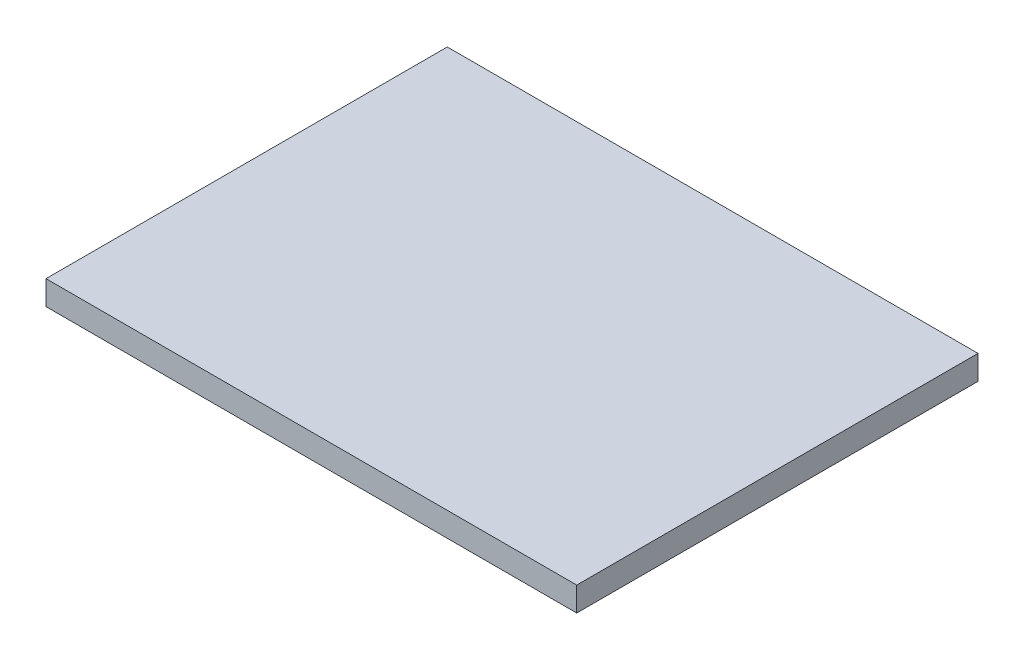
ISO-10303-21;
HEADER;
FILE_DESCRIPTION(('STEP AP214'),'2;1');
FILE_NAME('part.step','',(''),(''),'','','');
FILE_SCHEMA(('AUTOMOTIVE_DESIGN { 1 0 10303 214 1 1 1 1 }'));
ENDSEC;
DATA;
#1=APPLICATION_CONTEXT('core data for automotive mechanical design processes');
#2=APPLICATION_PROTOCOL_DEFINITION('international standard','automotive_design',2000,#1);
#3=PRODUCT_CONTEXT('',#1,'mechanical');
#4=PRODUCT('Part','Part','',(#3));
#5=PRODUCT_RELATED_PRODUCT_CATEGORY('part','',(#4));
#6=PRODUCT_DEFINITION_FORMATION('','',#4);
#7=PRODUCT_DEFINITION_CONTEXT('part definition',#1,'design');
#8=PRODUCT_DEFINITION('design','',#6,#7);
#9=PRODUCT_DEFINITION_SHAPE('','',#8);
#10=(LENGTH_UNIT() NAMED_UNIT(*) SI_UNIT(.MILLI.,.METRE.));
#11=(NAMED_UNIT(*) PLANE_ANGLE_UNIT() SI_UNIT($,.RADIAN.));
#12=(NAMED_UNIT(*) SI_UNIT($,.STERADIAN.) SOLID_ANGLE_UNIT());
#13=UNCERTAINTY_MEASURE_WITH_UNIT(LENGTH_MEASURE(1.E-05),#10,'distance_accuracy_value','');
#14=(GEOMETRIC_REPRESENTATION_CONTEXT(3) GLOBAL_UNCERTAINTY_ASSIGNED_CONTEXT((#13)) GLOBAL_UNIT_ASSIGNED_CONTEXT((#10,
#11,#12)) REPRESENTATION_CONTEXT('',''));
#15=CARTESIAN_POINT('',(0.,0.,0.));
#16=DIRECTION('',(0.,0.,1.));
#17=DIRECTION('',(1.,0.,0.));
#18=AXIS2_PLACEMENT_3D('',#15,#16,#17);
#19=CARTESIAN_POINT('',(0.,11.8872,0.));
#20=DIRECTION('',(1.,0.,0.));
#21=DIRECTION('',(0.,0.,-1.));
#22=AXIS2_PLACEMENT_3D('',#19,#20,#21);
#23=PLANE('',#22);
#24=DIRECTION('',(0.,0.,1.));
#25=VECTOR('',#24,1.);
#26=CARTESIAN_POINT('',(0.,0.,0.));
#27=LINE('',#26,#25);
#28=CARTESIAN_POINT('',(0.,0.,-196.85));
#29=VERTEX_POINT('',#28);
#30=CARTESIAN_POINT('',(0.,0.,0.));
#31=VERTEX_POINT('',#30);
#32=EDGE_CURVE('E96',#29,#31,#27,.T.);
#33=ORIENTED_EDGE('',*,*,#32,.T.);
#34=DIRECTION('',(0.,-1.,0.));
#35=VECTOR('',#34,1.);
#36=CARTESIAN_POINT('',(0.,11.8872,0.));
#37=LINE('',#36,#35);
#38=CARTESIAN_POINT('',(0.,11.8872,0.));
#39=VERTEX_POINT('',#38);
#40=EDGE_CURVE('E11',#39,#31,#37,.T.);
#41=ORIENTED_EDGE('',*,*,#40,.F.);
#42=DIRECTION('',(0.,0.,1.));
#43=VECTOR('',#42,1.);
#44=CARTESIAN_POINT('',(0.,11.8872,0.));
#45=LINE('',#44,#43);
#46=CARTESIAN_POINT('',(0.,11.8872,-196.85));
#47=VERTEX_POINT('',#46);
#48=EDGE_CURVE('E84',#47,#39,#45,.T.);
#49=ORIENTED_EDGE('',*,*,#48,.F.);
#50=DIRECTION('',(0.,-1.,0.));
#51=VECTOR('',#50,1.);
#52=CARTESIAN_POINT('',(0.,11.8872,-196.85));
#53=LINE('',#52,#51);
#54=EDGE_CURVE('E92',#47,#29,#53,.T.);
#55=ORIENTED_EDGE('',*,*,#54,.T.);
#56=EDGE_LOOP('',(#33,#41,#49,#55));
#57=FACE_BOUND('',#56,.T.);
#58=ADVANCED_FACE('F33',(#57),#23,.F.);
#59=CARTESIAN_POINT('',(0.,11.8872,0.));
#60=DIRECTION('',(0.,0.,-1.));
#61=DIRECTION('',(-1.,0.,0.));
#62=AXIS2_PLACEMENT_3D('',#59,#60,#61);
#63=PLANE('',#62);
#64=DIRECTION('',(1.,0.,0.));
#65=VECTOR('',#64,1.);
#66=CARTESIAN_POINT('',(0.,0.,0.));
#67=LINE('',#66,#65);
#68=CARTESIAN_POINT('',(260.35,0.,0.));
#69=VERTEX_POINT('',#68);
#70=EDGE_CURVE('E88',#31,#69,#67,.T.);
#71=ORIENTED_EDGE('',*,*,#70,.T.);
#72=DIRECTION('',(0.,-1.,0.));
#73=VECTOR('',#72,1.);
#74=CARTESIAN_POINT('',(260.35,11.8872,0.));
#75=LINE('',#74,#73);
#76=CARTESIAN_POINT('',(260.35,11.8872,0.));
#77=VERTEX_POINT('',#76);
#78=EDGE_CURVE('E41',#77,#69,#75,.T.);
#79=ORIENTED_EDGE('',*,*,#78,.F.);
#80=DIRECTION('',(1.,0.,0.));
#81=VECTOR('',#80,1.);
#82=CARTESIAN_POINT('',(0.,11.8872,0.));
#83=LINE('',#82,#81);
#84=EDGE_CURVE('E79',#39,#77,#83,.T.);
#85=ORIENTED_EDGE('',*,*,#84,.F.);
#86=ORIENTED_EDGE('',*,*,#40,.T.);
#87=EDGE_LOOP('',(#71,#79,#85,#86));
#88=FACE_BOUND('',#87,.T.);
#89=ADVANCED_FACE('F87',(#88),#63,.F.);
#90=CARTESIAN_POINT('',(260.35,11.8872,0.));
#91=DIRECTION('',(-1.,0.,0.));
#92=DIRECTION('',(0.,0.,1.));
#93=AXIS2_PLACEMENT_3D('',#90,#91,#92);
#94=PLANE('',#93);
#95=DIRECTION('',(0.,0.,-1.));
#96=VECTOR('',#95,1.);
#97=CARTESIAN_POINT('',(260.35,0.,0.));
#98=LINE('',#97,#96);
#99=CARTESIAN_POINT('',(260.35,0.,-196.85));
#100=VERTEX_POINT('',#99);
#101=EDGE_CURVE('E66',#69,#100,#98,.T.);
#102=ORIENTED_EDGE('',*,*,#101,.T.);
#103=DIRECTION('',(0.,-1.,0.));
#104=VECTOR('',#103,1.);
#105=CARTESIAN_POINT('',(260.35,11.8872,-196.85));
#106=LINE('',#105,#104);
#107=CARTESIAN_POINT('',(260.35,11.8872,-196.85));
#108=VERTEX_POINT('',#107);
#109=EDGE_CURVE('E89',#108,#100,#106,.T.);
#110=ORIENTED_EDGE('',*,*,#109,.F.);
#111=DIRECTION('',(0.,0.,-1.));
#112=VECTOR('',#111,1.);
#113=CARTESIAN_POINT('',(260.35,11.8872,0.));
#114=LINE('',#113,#112);
#115=EDGE_CURVE('E82',#77,#108,#114,.T.);
#116=ORIENTED_EDGE('',*,*,#115,.F.);
#117=ORIENTED_EDGE('',*,*,#78,.T.);
#118=EDGE_LOOP('',(#102,#110,#116,#117));
#119=FACE_BOUND('',#118,.T.);
#120=ADVANCED_FACE('F90',(#119),#94,.F.);
#121=CARTESIAN_POINT('',(0.,11.8872,-196.85));
#122=DIRECTION('',(0.,0.,1.));
#123=DIRECTION('',(1.,0.,0.));
#124=AXIS2_PLACEMENT_3D('',#121,#122,#123);
#125=PLANE('',#124);
#126=DIRECTION('',(-1.,0.,0.));
#127=VECTOR('',#126,1.);
#128=CARTESIAN_POINT('',(0.,0.,-196.85));
#129=LINE('',#128,#127);
#130=EDGE_CURVE('E72',#100,#29,#129,.T.);
#131=ORIENTED_EDGE('',*,*,#130,.T.);
#132=ORIENTED_EDGE('',*,*,#54,.F.);
#133=DIRECTION('',(-1.,0.,0.));
#134=VECTOR('',#133,1.);
#135=CARTESIAN_POINT('',(0.,11.8872,-196.85));
#136=LINE('',#135,#134);
#137=EDGE_CURVE('E49',#108,#47,#136,.T.);
#138=ORIENTED_EDGE('',*,*,#137,.F.);
#139=ORIENTED_EDGE('',*,*,#109,.T.);
#140=EDGE_LOOP('',(#131,#132,#138,#139));
#141=FACE_BOUND('',#140,.T.);
#142=ADVANCED_FACE('F103',(#141),#125,.F.);
#143=CARTESIAN_POINT('',(0.,11.8872,0.));
#144=DIRECTION('',(0.,-1.,0.));
#145=DIRECTION('',(0.,0.,-1.));
#146=AXIS2_PLACEMENT_3D('',#143,#144,#145);
#147=PLANE('',#146);
#148=ORIENTED_EDGE('',*,*,#48,.T.);
#149=ORIENTED_EDGE('',*,*,#84,.T.);
#150=ORIENTED_EDGE('',*,*,#115,.T.);
#151=ORIENTED_EDGE('',*,*,#137,.T.);
#152=EDGE_LOOP('',(#148,#149,#150,#151));
#153=FACE_BOUND('',#152,.T.);
#154=ADVANCED_FACE('F80',(#153),#147,.F.);
#155=CARTESIAN_POINT('',(0.,0.,0.));
#156=DIRECTION('',(0.,-1.,0.));
#157=DIRECTION('',(0.,0.,-1.));
#158=AXIS2_PLACEMENT_3D('',#155,#156,#157);
#159=PLANE('',#158);
#160=ORIENTED_EDGE('',*,*,#32,.F.);
#161=ORIENTED_EDGE('',*,*,#130,.F.);
#162=ORIENTED_EDGE('',*,*,#101,.F.);
#163=ORIENTED_EDGE('',*,*,#70,.F.);
#164=EDGE_LOOP('',(#160,#161,#162,#163));
#165=FACE_BOUND('',#164,.T.);
#166=ADVANCED_FACE('F106',(#165),#159,.T.);
#167=CLOSED_SHELL('',(#58,#89,#120,#142,#154,#166));
#168=MANIFOLD_SOLID_BREP('B2',#167);
#169=ADVANCED_BREP_SHAPE_REPRESENTATION('',(#18,#168),#14);
#170=SHAPE_DEFINITION_REPRESENTATION(#9,#169);
ENDSEC;
END-ISO-10303-21;
